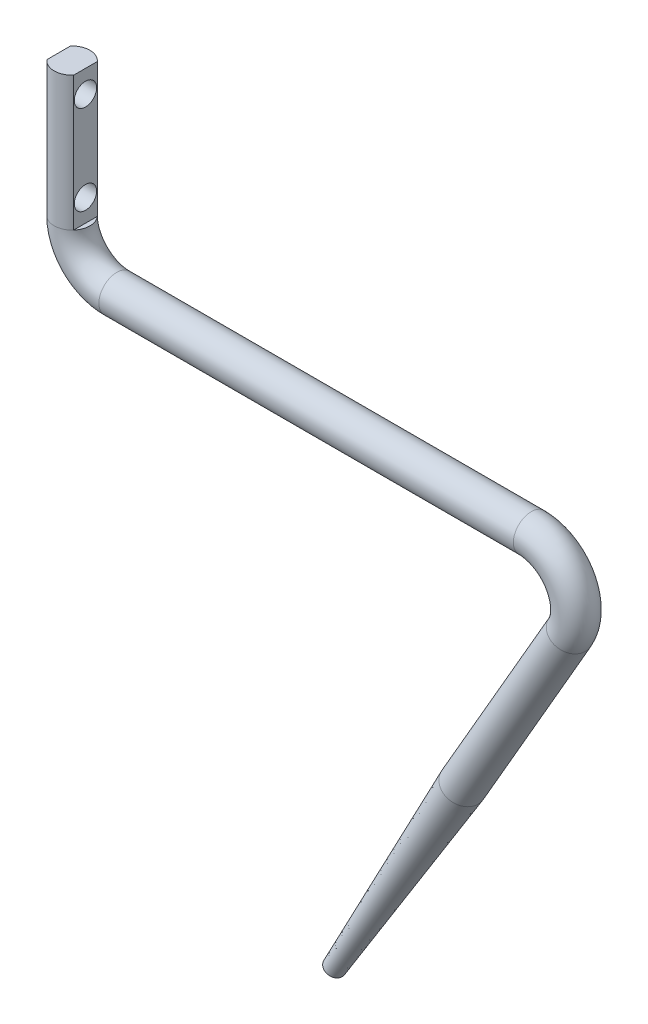
ISO-10303-21;
HEADER;
FILE_DESCRIPTION(('STEP AP214'),'2;1');
FILE_NAME('part.step','',(''),(''),'','','');
FILE_SCHEMA(('AUTOMOTIVE_DESIGN { 1 0 10303 214 1 1 1 1 }'));
ENDSEC;
DATA;
#1=APPLICATION_CONTEXT('core data for automotive mechanical design processes');
#2=APPLICATION_PROTOCOL_DEFINITION('international standard','automotive_design',2000,#1);
#3=PRODUCT_CONTEXT('',#1,'mechanical');
#4=PRODUCT('Part','Part','',(#3));
#5=PRODUCT_RELATED_PRODUCT_CATEGORY('part','',(#4));
#6=PRODUCT_DEFINITION_FORMATION('','',#4);
#7=PRODUCT_DEFINITION_CONTEXT('part definition',#1,'design');
#8=PRODUCT_DEFINITION('design','',#6,#7);
#9=PRODUCT_DEFINITION_SHAPE('','',#8);
#10=(LENGTH_UNIT() NAMED_UNIT(*) SI_UNIT(.MILLI.,.METRE.));
#11=(NAMED_UNIT(*) PLANE_ANGLE_UNIT() SI_UNIT($,.RADIAN.));
#12=(NAMED_UNIT(*) SI_UNIT($,.STERADIAN.) SOLID_ANGLE_UNIT());
#13=UNCERTAINTY_MEASURE_WITH_UNIT(LENGTH_MEASURE(1.E-05),#10,'distance_accuracy_value','');
#14=(GEOMETRIC_REPRESENTATION_CONTEXT(3) GLOBAL_UNCERTAINTY_ASSIGNED_CONTEXT((#13)) GLOBAL_UNIT_ASSIGNED_CONTEXT((#10,
#11,#12)) REPRESENTATION_CONTEXT('',''));
#15=CARTESIAN_POINT('',(0.,0.,0.));
#16=DIRECTION('',(0.,0.,1.));
#17=DIRECTION('',(1.,0.,0.));
#18=AXIS2_PLACEMENT_3D('',#15,#16,#17);
#19=CARTESIAN_POINT('',(0.,40.,0.));
#20=DIRECTION('',(0.,1.,0.));
#21=DIRECTION('',(0.,0.,1.));
#22=AXIS2_PLACEMENT_3D('',#19,#20,#21);
#23=PLANE('',#22);
#24=CARTESIAN_POINT('',(0.,40.,0.));
#25=DIRECTION('',(0.,1.,0.));
#26=DIRECTION('',(0.,0.,1.));
#27=AXIS2_PLACEMENT_3D('',#24,#25,#26);
#28=CIRCLE('',#27,4.);
#29=CARTESIAN_POINT('',(3.,40.,-2.64575131106459));
#30=VERTEX_POINT('',#29);
#31=CARTESIAN_POINT('',(-3.,40.,-2.64575131106459));
#32=VERTEX_POINT('',#31);
#33=EDGE_CURVE('E109',#30,#32,#28,.T.);
#34=ORIENTED_EDGE('',*,*,#33,.T.);
#35=DIRECTION('',(0.,0.,1.));
#36=VECTOR('',#35,1.);
#37=CARTESIAN_POINT('',(-3.,40.,-17.7651075584702));
#38=LINE('',#37,#36);
#39=CARTESIAN_POINT('',(-3.,40.,2.64575131106459));
#40=VERTEX_POINT('',#39);
#41=EDGE_CURVE('E94',#32,#40,#38,.T.);
#42=ORIENTED_EDGE('',*,*,#41,.T.);
#43=CARTESIAN_POINT('',(0.,40.,4.));
#44=VERTEX_POINT('',#43);
#45=EDGE_CURVE('E108',#40,#44,#28,.T.);
#46=ORIENTED_EDGE('',*,*,#45,.T.);
#47=CARTESIAN_POINT('',(3.,40.,2.64575131106458));
#48=VERTEX_POINT('',#47);
#49=EDGE_CURVE('E101',#44,#48,#28,.T.);
#50=ORIENTED_EDGE('',*,*,#49,.T.);
#51=DIRECTION('',(0.,0.,-1.));
#52=VECTOR('',#51,1.);
#53=CARTESIAN_POINT('',(3.,40.,-17.7651075584702));
#54=LINE('',#53,#52);
#55=EDGE_CURVE('E83',#48,#30,#54,.T.);
#56=ORIENTED_EDGE('',*,*,#55,.T.);
#57=EDGE_LOOP('',(#34,#42,#46,#50,#56));
#58=FACE_BOUND('',#57,.T.);
#59=ADVANCED_FACE('F40',(#58),#23,.T.);
#60=CARTESIAN_POINT('',(0.,40.,0.));
#61=DIRECTION('',(0.,-1.,0.));
#62=DIRECTION('',(0.,0.,-1.));
#63=AXIS2_PLACEMENT_3D('',#60,#61,#62);
#64=CYLINDRICAL_SURFACE('',#63,4.);
#65=DIRECTION('',(0.,-1.,0.));
#66=VECTOR('',#65,1.);
#67=CARTESIAN_POINT('',(-3.,40.,-2.64575131106459));
#68=LINE('',#67,#66);
#69=CARTESIAN_POINT('',(-3.,10.0000000000001,-2.64575131106459));
#70=VERTEX_POINT('',#69);
#71=EDGE_CURVE('E115',#32,#70,#68,.T.);
#72=ORIENTED_EDGE('',*,*,#71,.F.);
#73=ORIENTED_EDGE('',*,*,#33,.F.);
#74=DIRECTION('',(0.,-1.,0.));
#75=VECTOR('',#74,1.);
#76=CARTESIAN_POINT('',(3.,40.,-2.64575131106459));
#77=LINE('',#76,#75);
#78=CARTESIAN_POINT('',(3.,10.,-2.64575131106427));
#79=VERTEX_POINT('',#78);
#80=EDGE_CURVE('E89',#79,#30,#77,.F.);
#81=ORIENTED_EDGE('',*,*,#80,.F.);
#82=CARTESIAN_POINT('',(0.,10.0000000000001,0.));
#83=DIRECTION('',(0.,1.,0.));
#84=DIRECTION('',(0.,0.,1.));
#85=AXIS2_PLACEMENT_3D('',#82,#83,#84);
#86=CIRCLE('',#85,4.);
#87=EDGE_CURVE('E202',#79,#70,#86,.T.);
#88=ORIENTED_EDGE('',*,*,#87,.T.);
#89=EDGE_LOOP('',(#72,#73,#81,#88));
#90=FACE_BOUND('',#89,.T.);
#91=ADVANCED_FACE('F156',(#90),#64,.T.);
#92=DIRECTION('',(0.,-1.,0.));
#93=VECTOR('',#92,1.);
#94=CARTESIAN_POINT('',(-3.,40.,2.64575131106459));
#95=LINE('',#94,#93);
#96=CARTESIAN_POINT('',(-3.,10.,2.64575131106491));
#97=VERTEX_POINT('',#96);
#98=EDGE_CURVE('E105',#97,#40,#95,.F.);
#99=ORIENTED_EDGE('',*,*,#98,.F.);
#100=CARTESIAN_POINT('',(3.,10.0000000000001,2.64575131106459));
#101=VERTEX_POINT('',#100);
#102=EDGE_CURVE('E103',#97,#101,#86,.T.);
#103=ORIENTED_EDGE('',*,*,#102,.T.);
#104=DIRECTION('',(0.,-1.,0.));
#105=VECTOR('',#104,1.);
#106=CARTESIAN_POINT('',(3.,40.,2.64575131106459));
#107=LINE('',#106,#105);
#108=EDGE_CURVE('E86',#48,#101,#107,.T.);
#109=ORIENTED_EDGE('',*,*,#108,.F.);
#110=ORIENTED_EDGE('',*,*,#49,.F.);
#111=ORIENTED_EDGE('',*,*,#45,.F.);
#112=EDGE_LOOP('',(#99,#103,#109,#110,#111));
#113=FACE_BOUND('',#112,.T.);
#114=ADVANCED_FACE('F99',(#113),#64,.T.);
#115=CARTESIAN_POINT('',(58.68,-106.2,0.));
#116=DIRECTION('',(0.50003303393738,0.866006330791744,0.));
#117=DIRECTION('',(0.,0.,1.));
#118=AXIS2_PLACEMENT_3D('',#115,#116,#117);
#119=PLANE('',#118);
#120=CARTESIAN_POINT('',(58.68,-106.2,0.));
#121=DIRECTION('',(0.50003303393738,0.866006330791744,0.));
#122=DIRECTION('',(-0.866006330791744,0.50003303393738,0.));
#123=AXIS2_PLACEMENT_3D('',#120,#121,#122);
#124=CIRCLE('',#123,1.9999999999994);
#125=CARTESIAN_POINT('',(56.947987338417,-105.199933932126,0.));
#126=VERTEX_POINT('',#125);
#127=EDGE_CURVE('E12',#126,#126,#124,.F.);
#128=ORIENTED_EDGE('',*,*,#127,.T.);
#129=EDGE_LOOP('',(#128));
#130=FACE_BOUND('',#129,.T.);
#131=ADVANCED_FACE('F163',(#130),#119,.F.);
#132=CARTESIAN_POINT('',(10.,10.,0.));
#133=DIRECTION('',(0.,0.,1.));
#134=DIRECTION('',(1.,0.,0.));
#135=AXIS2_PLACEMENT_3D('',#132,#133,#134);
#136=TOROIDAL_SURFACE('',#135,10.0000000000003,4.);
#137=CARTESIAN_POINT('',(10.0000000000001,0.,0.));
#138=DIRECTION('',(-1.,0.,0.));
#139=DIRECTION('',(0.,0.,1.));
#140=AXIS2_PLACEMENT_3D('',#137,#138,#139);
#141=CIRCLE('',#140,4.);
#142=CARTESIAN_POINT('',(10.0000000000001,0.,4.));
#143=VERTEX_POINT('',#142);
#144=EDGE_CURVE('E203',#143,#143,#141,.T.);
#145=ORIENTED_EDGE('',*,*,#144,.T.);
#146=EDGE_LOOP('',(#145));
#147=FACE_BOUND('',#146,.T.);
#148=EDGE_CURVE('E113',#101,#79,#86,.T.);
#149=ORIENTED_EDGE('',*,*,#148,.F.);
#150=ORIENTED_EDGE('',*,*,#102,.F.);
#151=EDGE_CURVE('E111',#70,#97,#86,.T.);
#152=ORIENTED_EDGE('',*,*,#151,.F.);
#153=ORIENTED_EDGE('',*,*,#87,.F.);
#154=EDGE_LOOP('',(#149,#150,#152,#153));
#155=FACE_BOUND('',#154,.T.);
#156=ADVANCED_FACE('F166',(#147,#155),#136,.T.);
#157=CARTESIAN_POINT('',(10.0000000000001,0.,0.));
#158=DIRECTION('',(1.,0.,0.));
#159=DIRECTION('',(0.,0.,-1.));
#160=AXIS2_PLACEMENT_3D('',#157,#158,#159);
#161=CYLINDRICAL_SURFACE('',#160,4.);
#162=CARTESIAN_POINT('',(102.678729004602,0.,0.));
#163=DIRECTION('',(-1.,0.,0.));
#164=DIRECTION('',(0.,0.,1.));
#165=AXIS2_PLACEMENT_3D('',#162,#163,#164);
#166=CIRCLE('',#165,4.);
#167=CARTESIAN_POINT('',(102.678729004602,3.99999999999999,0.));
#168=VERTEX_POINT('',#167);
#169=EDGE_CURVE('E205',#168,#168,#166,.T.);
#170=ORIENTED_EDGE('',*,*,#169,.T.);
#171=EDGE_LOOP('',(#170));
#172=FACE_BOUND('',#171,.T.);
#173=ORIENTED_EDGE('',*,*,#144,.F.);
#174=EDGE_LOOP('',(#173));
#175=FACE_BOUND('',#174,.T.);
#176=ADVANCED_FACE('F175',(#172,#175),#161,.T.);
#177=CARTESIAN_POINT('',(102.678729004602,-10.,0.));
#178=DIRECTION('',(0.,0.,-1.));
#179=DIRECTION('',(-1.,0.,0.));
#180=AXIS2_PLACEMENT_3D('',#177,#178,#179);
#181=TOROIDAL_SURFACE('',#180,9.99999999999999,4.);
#182=CARTESIAN_POINT('',(111.33879231252,-15.0003303393738,0.));
#183=DIRECTION('',(0.500033033937379,0.866006330791744,0.));
#184=DIRECTION('',(0.,0.,1.));
#185=AXIS2_PLACEMENT_3D('',#182,#183,#184);
#186=CIRCLE('',#185,4.);
#187=CARTESIAN_POINT('',(114.802817635687,-17.0004624751233,0.));
#188=VERTEX_POINT('',#187);
#189=EDGE_CURVE('E210',#188,#188,#186,.T.);
#190=CARTESIAN_POINT('',(102.678729004602,-10.,0.));
#191=DIRECTION('',(0.,0.,-1.));
#192=DIRECTION('',(-1.,0.,0.));
#193=AXIS2_PLACEMENT_3D('',#190,#191,#192);
#194=CIRCLE('',#193,14.);
#195=EDGE_CURVE('',#168,#188,#194,.T.);
#196=ORIENTED_EDGE('',*,*,#169,.F.);
#197=ORIENTED_EDGE('',*,*,#189,.T.);
#198=ORIENTED_EDGE('',*,*,#195,.T.);
#199=ORIENTED_EDGE('',*,*,#195,.F.);
#200=EDGE_LOOP('',(#196,#198,#197,#199));
#201=FACE_BOUND('',#200,.T.);
#202=ADVANCED_FACE('F171',(#201),#181,.T.);
#203=CARTESIAN_POINT('',(111.33879231252,-15.0003303393738,0.));
#204=DIRECTION('',(-0.50003303393738,-0.866006330791744,0.));
#205=DIRECTION('',(0.866006330791744,-0.50003303393738,0.));
#206=AXIS2_PLACEMENT_3D('',#203,#204,#205);
#207=CYLINDRICAL_SURFACE('',#206,4.);
#208=CARTESIAN_POINT('',(87.3181452193172,-56.6016467336679,0.));
#209=DIRECTION('',(0.50003303393738,0.866006330791744,0.));
#210=DIRECTION('',(-0.866006330791744,0.50003303393738,0.));
#211=AXIS2_PLACEMENT_3D('',#208,#209,#210);
#212=CIRCLE('',#211,4.);
#213=CARTESIAN_POINT('',(83.8541198961502,-54.6015145979184,0.));
#214=VERTEX_POINT('',#213);
#215=EDGE_CURVE('E48',#214,#214,#212,.T.);
#216=ORIENTED_EDGE('',*,*,#215,.T.);
#217=EDGE_LOOP('',(#216));
#218=FACE_BOUND('',#217,.T.);
#219=ORIENTED_EDGE('',*,*,#189,.F.);
#220=EDGE_LOOP('',(#219));
#221=FACE_BOUND('',#220,.T.);
#222=ADVANCED_FACE('F168',(#218,#221),#207,.T.);
#223=CARTESIAN_POINT('',(87.3181452193172,-56.6016467336679,0.));
#224=DIRECTION('',(0.50003303393738,0.866006330791744,0.));
#225=DIRECTION('',(-0.866006330791744,0.50003303393738,0.));
#226=AXIS2_PLACEMENT_3D('',#223,#224,#225);
#227=CONICAL_SURFACE('',#226,4.,0.0349065850398896);
#228=ORIENTED_EDGE('',*,*,#127,.F.);
#229=EDGE_LOOP('',(#228));
#230=FACE_BOUND('',#229,.T.);
#231=ORIENTED_EDGE('',*,*,#215,.F.);
#232=EDGE_LOOP('',(#231));
#233=FACE_BOUND('',#232,.T.);
#234=ADVANCED_FACE('F42',(#230,#233),#227,.T.);
#235=CARTESIAN_POINT('',(56.3393645023012,10.,0.));
#236=DIRECTION('',(0.,1.,0.));
#237=DIRECTION('',(0.,0.,1.));
#238=AXIS2_PLACEMENT_3D('',#235,#236,#237);
#239=PLANE('',#238);
#240=ORIENTED_EDGE('',*,*,#151,.T.);
#241=DIRECTION('',(0.,0.,1.));
#242=VECTOR('',#241,1.);
#243=CARTESIAN_POINT('',(-3.,10.,-17.7651075584702));
#244=LINE('',#243,#242);
#245=EDGE_CURVE('E54',#70,#97,#244,.T.);
#246=ORIENTED_EDGE('',*,*,#245,.F.);
#247=EDGE_LOOP('',(#240,#246));
#248=FACE_BOUND('',#247,.T.);
#249=ADVANCED_FACE('F186',(#248),#239,.T.);
#250=CARTESIAN_POINT('',(-3.,10.,-17.7651075584702));
#251=DIRECTION('',(-1.,0.,0.));
#252=DIRECTION('',(0.,0.,1.));
#253=AXIS2_PLACEMENT_3D('',#250,#251,#252);
#254=PLANE('',#253);
#255=CARTESIAN_POINT('',(-3.,35.0000000000001,0.));
#256=DIRECTION('',(-1.,0.,0.));
#257=DIRECTION('',(0.,0.,1.));
#258=AXIS2_PLACEMENT_3D('',#255,#256,#257);
#259=CIRCLE('',#258,2.49999999999999);
#260=CARTESIAN_POINT('',(-3.,35.0000000000001,2.49999999999999));
#261=VERTEX_POINT('',#260);
#262=EDGE_CURVE('E131',#261,#261,#259,.T.);
#263=ORIENTED_EDGE('',*,*,#262,.F.);
#264=EDGE_LOOP('',(#263));
#265=FACE_BOUND('',#264,.T.);
#266=CARTESIAN_POINT('',(-3.,15.0000000000001,0.));
#267=DIRECTION('',(-1.,0.,0.));
#268=DIRECTION('',(0.,0.,1.));
#269=AXIS2_PLACEMENT_3D('',#266,#267,#268);
#270=CIRCLE('',#269,2.49999999999999);
#271=CARTESIAN_POINT('',(-3.,15.0000000000001,2.49999999999999));
#272=VERTEX_POINT('',#271);
#273=EDGE_CURVE('E123',#272,#272,#270,.T.);
#274=ORIENTED_EDGE('',*,*,#273,.F.);
#275=EDGE_LOOP('',(#274));
#276=FACE_BOUND('',#275,.T.);
#277=ORIENTED_EDGE('',*,*,#71,.T.);
#278=ORIENTED_EDGE('',*,*,#245,.T.);
#279=ORIENTED_EDGE('',*,*,#98,.T.);
#280=ORIENTED_EDGE('',*,*,#41,.F.);
#281=EDGE_LOOP('',(#277,#278,#279,#280));
#282=FACE_BOUND('',#281,.T.);
#283=ADVANCED_FACE('F185',(#265,#276,#282),#254,.T.);
#284=ORIENTED_EDGE('',*,*,#148,.T.);
#285=DIRECTION('',(0.,0.,-1.));
#286=VECTOR('',#285,1.);
#287=CARTESIAN_POINT('',(3.,10.,-17.7651075584702));
#288=LINE('',#287,#286);
#289=EDGE_CURVE('E61',#101,#79,#288,.T.);
#290=ORIENTED_EDGE('',*,*,#289,.F.);
#291=EDGE_LOOP('',(#284,#290));
#292=FACE_BOUND('',#291,.T.);
#293=ADVANCED_FACE('F143',(#292),#239,.T.);
#294=CARTESIAN_POINT('',(3.,10.,-17.7651075584702));
#295=DIRECTION('',(1.,0.,0.));
#296=DIRECTION('',(0.,0.,-1.));
#297=AXIS2_PLACEMENT_3D('',#294,#295,#296);
#298=PLANE('',#297);
#299=CARTESIAN_POINT('',(3.,35.0000000000001,0.));
#300=DIRECTION('',(1.,0.,0.));
#301=DIRECTION('',(0.,0.,-1.));
#302=AXIS2_PLACEMENT_3D('',#299,#300,#301);
#303=CIRCLE('',#302,2.49999999999999);
#304=CARTESIAN_POINT('',(3.,35.0000000000001,-2.49999999999999));
#305=VERTEX_POINT('',#304);
#306=EDGE_CURVE('E134',#305,#305,#303,.T.);
#307=ORIENTED_EDGE('',*,*,#306,.F.);
#308=EDGE_LOOP('',(#307));
#309=FACE_BOUND('',#308,.T.);
#310=CARTESIAN_POINT('',(3.,15.0000000000001,0.));
#311=DIRECTION('',(1.,0.,0.));
#312=DIRECTION('',(0.,0.,-1.));
#313=AXIS2_PLACEMENT_3D('',#310,#311,#312);
#314=CIRCLE('',#313,2.49999999999999);
#315=CARTESIAN_POINT('',(3.,15.0000000000001,-2.49999999999999));
#316=VERTEX_POINT('',#315);
#317=EDGE_CURVE('E128',#316,#316,#314,.T.);
#318=ORIENTED_EDGE('',*,*,#317,.F.);
#319=EDGE_LOOP('',(#318));
#320=FACE_BOUND('',#319,.T.);
#321=ORIENTED_EDGE('',*,*,#108,.T.);
#322=ORIENTED_EDGE('',*,*,#289,.T.);
#323=ORIENTED_EDGE('',*,*,#80,.T.);
#324=ORIENTED_EDGE('',*,*,#55,.F.);
#325=EDGE_LOOP('',(#321,#322,#323,#324));
#326=FACE_BOUND('',#325,.T.);
#327=ADVANCED_FACE('F85',(#309,#320,#326),#298,.T.);
#328=CARTESIAN_POINT('',(3.,15.0000000000001,0.));
#329=DIRECTION('',(1.,0.,0.));
#330=DIRECTION('',(0.,0.,-1.));
#331=AXIS2_PLACEMENT_3D('',#328,#329,#330);
#332=CYLINDRICAL_SURFACE('',#331,2.49999999999999);
#333=ORIENTED_EDGE('',*,*,#273,.T.);
#334=EDGE_LOOP('',(#333));
#335=FACE_BOUND('',#334,.T.);
#336=ORIENTED_EDGE('',*,*,#317,.T.);
#337=EDGE_LOOP('',(#336));
#338=FACE_BOUND('',#337,.T.);
#339=ADVANCED_FACE('F142',(#335,#338),#332,.F.);
#340=CARTESIAN_POINT('',(3.,35.0000000000001,0.));
#341=DIRECTION('',(1.,0.,0.));
#342=DIRECTION('',(0.,0.,-1.));
#343=AXIS2_PLACEMENT_3D('',#340,#341,#342);
#344=CYLINDRICAL_SURFACE('',#343,2.49999999999999);
#345=ORIENTED_EDGE('',*,*,#262,.T.);
#346=EDGE_LOOP('',(#345));
#347=FACE_BOUND('',#346,.T.);
#348=ORIENTED_EDGE('',*,*,#306,.T.);
#349=EDGE_LOOP('',(#348));
#350=FACE_BOUND('',#349,.T.);
#351=ADVANCED_FACE('F138',(#347,#350),#344,.F.);
#352=CLOSED_SHELL('',(#59,#91,#114,#131,#156,#176,#202,#222,#234,#249,#283,#293,#327,#339,#351));
#353=MANIFOLD_SOLID_BREP('B2',#352);
#354=ADVANCED_BREP_SHAPE_REPRESENTATION('',(#18,#353),#14);
#355=SHAPE_DEFINITION_REPRESENTATION(#9,#354);
ENDSEC;
END-ISO-10303-21;
